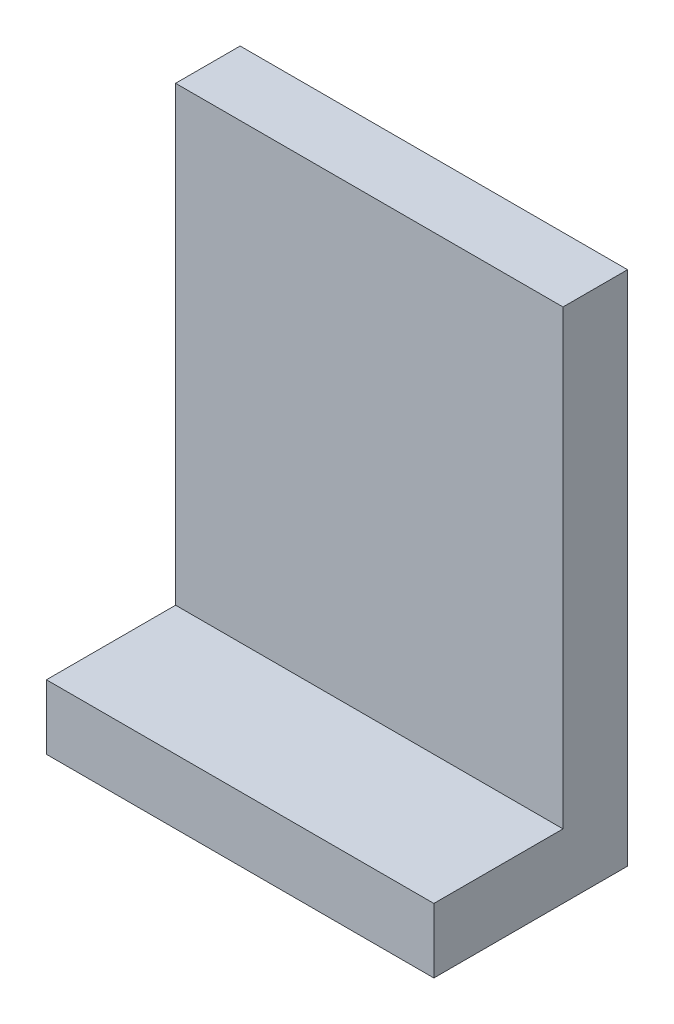
ISO-10303-21;
HEADER;
FILE_DESCRIPTION(('STEP AP214'),'2;1');
FILE_NAME('part.step','',(''),(''),'','','');
FILE_SCHEMA(('AUTOMOTIVE_DESIGN { 1 0 10303 214 1 1 1 1 }'));
ENDSEC;
DATA;
#1=APPLICATION_CONTEXT('core data for automotive mechanical design processes');
#2=APPLICATION_PROTOCOL_DEFINITION('international standard','automotive_design',2000,#1);
#3=PRODUCT_CONTEXT('',#1,'mechanical');
#4=PRODUCT('Part','Part','',(#3));
#5=PRODUCT_RELATED_PRODUCT_CATEGORY('part','',(#4));
#6=PRODUCT_DEFINITION_FORMATION('','',#4);
#7=PRODUCT_DEFINITION_CONTEXT('part definition',#1,'design');
#8=PRODUCT_DEFINITION('design','',#6,#7);
#9=PRODUCT_DEFINITION_SHAPE('','',#8);
#10=(LENGTH_UNIT() NAMED_UNIT(*) SI_UNIT(.MILLI.,.METRE.));
#11=(NAMED_UNIT(*) PLANE_ANGLE_UNIT() SI_UNIT($,.RADIAN.));
#12=(NAMED_UNIT(*) SI_UNIT($,.STERADIAN.) SOLID_ANGLE_UNIT());
#13=UNCERTAINTY_MEASURE_WITH_UNIT(LENGTH_MEASURE(1.E-05),#10,'distance_accuracy_value','');
#14=(GEOMETRIC_REPRESENTATION_CONTEXT(3) GLOBAL_UNCERTAINTY_ASSIGNED_CONTEXT((#13)) GLOBAL_UNIT_ASSIGNED_CONTEXT((#10,
#11,#12)) REPRESENTATION_CONTEXT('',''));
#15=CARTESIAN_POINT('',(0.,0.,0.));
#16=DIRECTION('',(0.,0.,1.));
#17=DIRECTION('',(1.,0.,0.));
#18=AXIS2_PLACEMENT_3D('',#15,#16,#17);
#19=CARTESIAN_POINT('',(60.,10.,0.));
#20=DIRECTION('',(-1.,0.,0.));
#21=DIRECTION('',(0.,0.,1.));
#22=AXIS2_PLACEMENT_3D('',#19,#20,#21);
#23=PLANE('',#22);
#24=DIRECTION('',(0.,0.,-1.));
#25=VECTOR('',#24,1.);
#26=CARTESIAN_POINT('',(60.,0.,0.));
#27=LINE('',#26,#25);
#28=CARTESIAN_POINT('',(60.,0.,0.));
#29=VERTEX_POINT('',#28);
#30=CARTESIAN_POINT('',(60.,0.,-30.));
#31=VERTEX_POINT('',#30);
#32=EDGE_CURVE('E89',#29,#31,#27,.T.);
#33=ORIENTED_EDGE('',*,*,#32,.T.);
#34=DIRECTION('',(0.,-1.,0.));
#35=VECTOR('',#34,1.);
#36=CARTESIAN_POINT('',(60.,10.,-30.));
#37=LINE('',#36,#35);
#38=CARTESIAN_POINT('',(60.,80.,-30.));
#39=VERTEX_POINT('',#38);
#40=EDGE_CURVE('E11',#39,#31,#37,.T.);
#41=ORIENTED_EDGE('',*,*,#40,.F.);
#42=DIRECTION('',(0.,0.,-1.));
#43=VECTOR('',#42,1.);
#44=CARTESIAN_POINT('',(60.,80.,-30.));
#45=LINE('',#44,#43);
#46=CARTESIAN_POINT('',(60.,80.,-20.));
#47=VERTEX_POINT('',#46);
#48=EDGE_CURVE('E122',#47,#39,#45,.T.);
#49=ORIENTED_EDGE('',*,*,#48,.F.);
#50=DIRECTION('',(0.,-1.,0.));
#51=VECTOR('',#50,1.);
#52=CARTESIAN_POINT('',(60.,80.,-20.));
#53=LINE('',#52,#51);
#54=CARTESIAN_POINT('',(60.,10.,-20.));
#55=VERTEX_POINT('',#54);
#56=EDGE_CURVE('E100',#47,#55,#53,.T.);
#57=ORIENTED_EDGE('',*,*,#56,.T.);
#58=DIRECTION('',(0.,0.,-1.));
#59=VECTOR('',#58,1.);
#60=CARTESIAN_POINT('',(60.,10.,0.));
#61=LINE('',#60,#59);
#62=CARTESIAN_POINT('',(60.,10.,0.));
#63=VERTEX_POINT('',#62);
#64=EDGE_CURVE('E83',#63,#55,#61,.T.);
#65=ORIENTED_EDGE('',*,*,#64,.F.);
#66=DIRECTION('',(0.,-1.,0.));
#67=VECTOR('',#66,1.);
#68=CARTESIAN_POINT('',(60.,10.,0.));
#69=LINE('',#68,#67);
#70=EDGE_CURVE('E76',#63,#29,#69,.T.);
#71=ORIENTED_EDGE('',*,*,#70,.T.);
#72=EDGE_LOOP('',(#33,#41,#49,#57,#65,#71));
#73=FACE_BOUND('',#72,.T.);
#74=ADVANCED_FACE('F35',(#73),#23,.F.);
#75=CARTESIAN_POINT('',(0.,10.,-30.));
#76=DIRECTION('',(0.,0.,-1.));
#77=DIRECTION('',(-1.,0.,0.));
#78=AXIS2_PLACEMENT_3D('',#75,#76,#77);
#79=PLANE('',#78);
#80=DIRECTION('',(1.,0.,0.));
#81=VECTOR('',#80,1.);
#82=CARTESIAN_POINT('',(0.,0.,-30.));
#83=LINE('',#82,#81);
#84=CARTESIAN_POINT('',(0.,0.,-30.));
#85=VERTEX_POINT('',#84);
#86=EDGE_CURVE('E95',#85,#31,#83,.T.);
#87=ORIENTED_EDGE('',*,*,#86,.F.);
#88=DIRECTION('',(0.,-1.,0.));
#89=VECTOR('',#88,1.);
#90=CARTESIAN_POINT('',(0.,10.,-30.));
#91=LINE('',#90,#89);
#92=CARTESIAN_POINT('',(0.,80.,-30.));
#93=VERTEX_POINT('',#92);
#94=EDGE_CURVE('E42',#93,#85,#91,.T.);
#95=ORIENTED_EDGE('',*,*,#94,.F.);
#96=DIRECTION('',(-1.,0.,0.));
#97=VECTOR('',#96,1.);
#98=CARTESIAN_POINT('',(0.,80.,-30.));
#99=LINE('',#98,#97);
#100=EDGE_CURVE('E118',#39,#93,#99,.T.);
#101=ORIENTED_EDGE('',*,*,#100,.F.);
#102=ORIENTED_EDGE('',*,*,#40,.T.);
#103=EDGE_LOOP('',(#87,#95,#101,#102));
#104=FACE_BOUND('',#103,.T.);
#105=ADVANCED_FACE('F117',(#104),#79,.T.);
#106=CARTESIAN_POINT('',(0.,10.,0.));
#107=DIRECTION('',(-1.,0.,0.));
#108=DIRECTION('',(0.,0.,1.));
#109=AXIS2_PLACEMENT_3D('',#106,#107,#108);
#110=PLANE('',#109);
#111=DIRECTION('',(0.,0.,-1.));
#112=VECTOR('',#111,1.);
#113=CARTESIAN_POINT('',(0.,0.,0.));
#114=LINE('',#113,#112);
#115=CARTESIAN_POINT('',(0.,0.,0.));
#116=VERTEX_POINT('',#115);
#117=EDGE_CURVE('E84',#116,#85,#114,.T.);
#118=ORIENTED_EDGE('',*,*,#117,.F.);
#119=DIRECTION('',(0.,-1.,0.));
#120=VECTOR('',#119,1.);
#121=CARTESIAN_POINT('',(0.,10.,0.));
#122=LINE('',#121,#120);
#123=CARTESIAN_POINT('',(0.,10.,0.));
#124=VERTEX_POINT('',#123);
#125=EDGE_CURVE('E78',#124,#116,#122,.T.);
#126=ORIENTED_EDGE('',*,*,#125,.F.);
#127=DIRECTION('',(0.,0.,-1.));
#128=VECTOR('',#127,1.);
#129=CARTESIAN_POINT('',(0.,10.,0.));
#130=LINE('',#129,#128);
#131=CARTESIAN_POINT('',(0.,10.,-20.));
#132=VERTEX_POINT('',#131);
#133=EDGE_CURVE('E136',#124,#132,#130,.T.);
#134=ORIENTED_EDGE('',*,*,#133,.T.);
#135=DIRECTION('',(0.,-1.,0.));
#136=VECTOR('',#135,1.);
#137=CARTESIAN_POINT('',(0.,80.,-20.));
#138=LINE('',#137,#136);
#139=CARTESIAN_POINT('',(0.,80.,-20.));
#140=VERTEX_POINT('',#139);
#141=EDGE_CURVE('E96',#140,#132,#138,.T.);
#142=ORIENTED_EDGE('',*,*,#141,.F.);
#143=DIRECTION('',(0.,0.,1.));
#144=VECTOR('',#143,1.);
#145=CARTESIAN_POINT('',(0.,80.,-20.));
#146=LINE('',#145,#144);
#147=EDGE_CURVE('E113',#93,#140,#146,.T.);
#148=ORIENTED_EDGE('',*,*,#147,.F.);
#149=ORIENTED_EDGE('',*,*,#94,.T.);
#150=EDGE_LOOP('',(#118,#126,#134,#142,#148,#149));
#151=FACE_BOUND('',#150,.T.);
#152=ADVANCED_FACE('F109',(#151),#110,.T.);
#153=CARTESIAN_POINT('',(0.,10.,0.));
#154=DIRECTION('',(0.,0.,-1.));
#155=DIRECTION('',(-1.,0.,0.));
#156=AXIS2_PLACEMENT_3D('',#153,#154,#155);
#157=PLANE('',#156);
#158=DIRECTION('',(1.,0.,0.));
#159=VECTOR('',#158,1.);
#160=CARTESIAN_POINT('',(0.,0.,0.));
#161=LINE('',#160,#159);
#162=EDGE_CURVE('E73',#116,#29,#161,.T.);
#163=ORIENTED_EDGE('',*,*,#162,.T.);
#164=ORIENTED_EDGE('',*,*,#70,.F.);
#165=DIRECTION('',(1.,0.,0.));
#166=VECTOR('',#165,1.);
#167=CARTESIAN_POINT('',(0.,10.,0.));
#168=LINE('',#167,#166);
#169=EDGE_CURVE('E55',#124,#63,#168,.T.);
#170=ORIENTED_EDGE('',*,*,#169,.F.);
#171=ORIENTED_EDGE('',*,*,#125,.T.);
#172=EDGE_LOOP('',(#163,#164,#170,#171));
#173=FACE_BOUND('',#172,.T.);
#174=ADVANCED_FACE('F75',(#173),#157,.F.);
#175=CARTESIAN_POINT('',(0.,10.,0.));
#176=DIRECTION('',(0.,1.,0.));
#177=DIRECTION('',(0.,0.,1.));
#178=AXIS2_PLACEMENT_3D('',#175,#176,#177);
#179=PLANE('',#178);
#180=DIRECTION('',(1.,0.,0.));
#181=VECTOR('',#180,1.);
#182=CARTESIAN_POINT('',(60.,10.,-20.));
#183=LINE('',#182,#181);
#184=EDGE_CURVE('E49',#132,#55,#183,.T.);
#185=ORIENTED_EDGE('',*,*,#184,.F.);
#186=ORIENTED_EDGE('',*,*,#133,.F.);
#187=ORIENTED_EDGE('',*,*,#169,.T.);
#188=ORIENTED_EDGE('',*,*,#64,.T.);
#189=EDGE_LOOP('',(#185,#186,#187,#188));
#190=FACE_BOUND('',#189,.T.);
#191=ADVANCED_FACE('F144',(#190),#179,.T.);
#192=CARTESIAN_POINT('',(0.,0.,0.));
#193=DIRECTION('',(0.,1.,0.));
#194=DIRECTION('',(0.,0.,1.));
#195=AXIS2_PLACEMENT_3D('',#192,#193,#194);
#196=PLANE('',#195);
#197=ORIENTED_EDGE('',*,*,#32,.F.);
#198=ORIENTED_EDGE('',*,*,#162,.F.);
#199=ORIENTED_EDGE('',*,*,#117,.T.);
#200=ORIENTED_EDGE('',*,*,#86,.T.);
#201=EDGE_LOOP('',(#197,#198,#199,#200));
#202=FACE_BOUND('',#201,.T.);
#203=ADVANCED_FACE('F93',(#202),#196,.F.);
#204=CARTESIAN_POINT('',(60.,80.,-20.));
#205=DIRECTION('',(0.,0.,-1.));
#206=DIRECTION('',(-1.,0.,0.));
#207=AXIS2_PLACEMENT_3D('',#204,#205,#206);
#208=PLANE('',#207);
#209=ORIENTED_EDGE('',*,*,#184,.T.);
#210=ORIENTED_EDGE('',*,*,#56,.F.);
#211=DIRECTION('',(1.,0.,0.));
#212=VECTOR('',#211,1.);
#213=CARTESIAN_POINT('',(60.,80.,-20.));
#214=LINE('',#213,#212);
#215=EDGE_CURVE('E128',#140,#47,#214,.T.);
#216=ORIENTED_EDGE('',*,*,#215,.F.);
#217=ORIENTED_EDGE('',*,*,#141,.T.);
#218=EDGE_LOOP('',(#209,#210,#216,#217));
#219=FACE_BOUND('',#218,.T.);
#220=ADVANCED_FACE('F139',(#219),#208,.F.);
#221=CARTESIAN_POINT('',(0.,80.,0.));
#222=DIRECTION('',(0.,-1.,0.));
#223=DIRECTION('',(0.,0.,-1.));
#224=AXIS2_PLACEMENT_3D('',#221,#222,#223);
#225=PLANE('',#224);
#226=ORIENTED_EDGE('',*,*,#100,.T.);
#227=ORIENTED_EDGE('',*,*,#147,.T.);
#228=ORIENTED_EDGE('',*,*,#215,.T.);
#229=ORIENTED_EDGE('',*,*,#48,.T.);
#230=EDGE_LOOP('',(#226,#227,#228,#229));
#231=FACE_BOUND('',#230,.T.);
#232=ADVANCED_FACE('F126',(#231),#225,.F.);
#233=CLOSED_SHELL('',(#74,#105,#152,#174,#191,#203,#220,#232));
#234=MANIFOLD_SOLID_BREP('B2',#233);
#235=ADVANCED_BREP_SHAPE_REPRESENTATION('',(#18,#234),#14);
#236=SHAPE_DEFINITION_REPRESENTATION(#9,#235);
ENDSEC;
END-ISO-10303-21;
